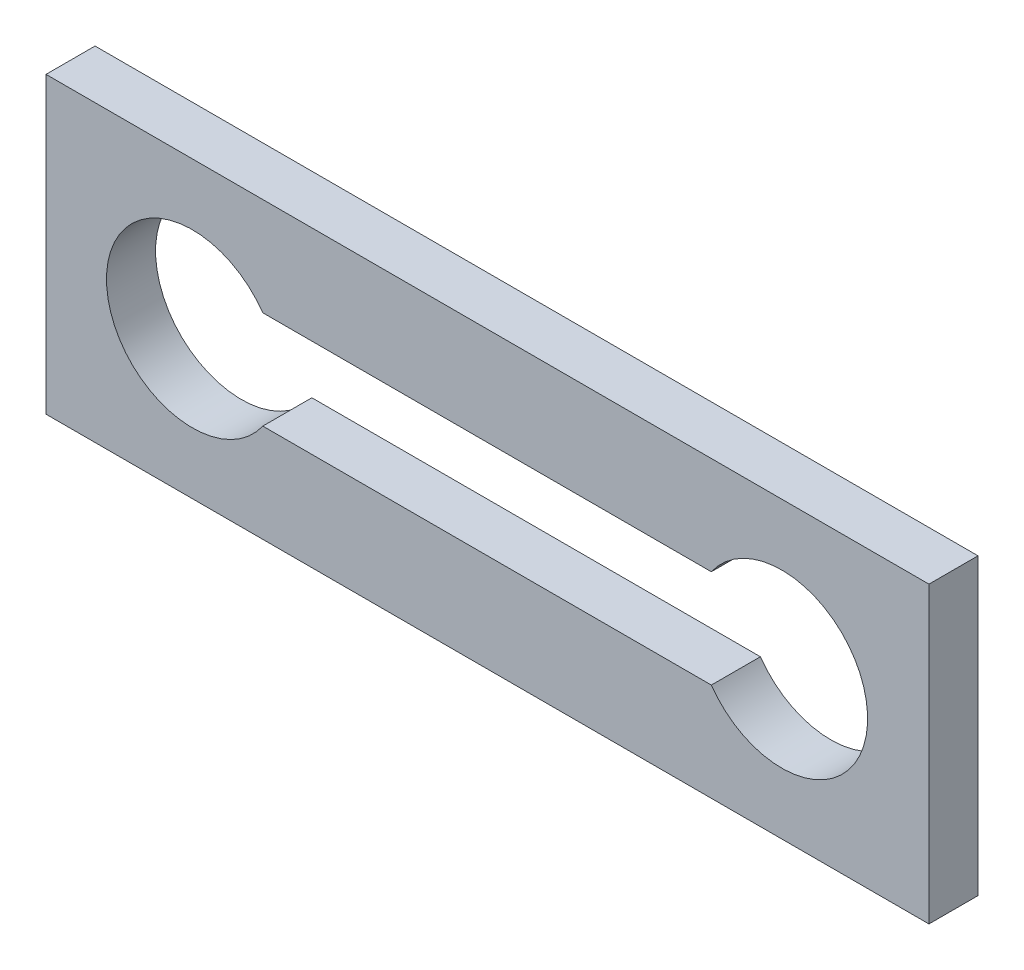
ISO-10303-21;
HEADER;
FILE_DESCRIPTION(('STEP AP214'),'2;1');
FILE_NAME('part.step','',(''),(''),'','','');
FILE_SCHEMA(('AUTOMOTIVE_DESIGN { 1 0 10303 214 1 1 1 1 }'));
ENDSEC;
DATA;
#1=APPLICATION_CONTEXT('core data for automotive mechanical design processes');
#2=APPLICATION_PROTOCOL_DEFINITION('international standard','automotive_design',2000,#1);
#3=PRODUCT_CONTEXT('',#1,'mechanical');
#4=PRODUCT('Part','Part','',(#3));
#5=PRODUCT_RELATED_PRODUCT_CATEGORY('part','',(#4));
#6=PRODUCT_DEFINITION_FORMATION('','',#4);
#7=PRODUCT_DEFINITION_CONTEXT('part definition',#1,'design');
#8=PRODUCT_DEFINITION('design','',#6,#7);
#9=PRODUCT_DEFINITION_SHAPE('','',#8);
#10=(LENGTH_UNIT() NAMED_UNIT(*) SI_UNIT(.MILLI.,.METRE.));
#11=(NAMED_UNIT(*) PLANE_ANGLE_UNIT() SI_UNIT($,.RADIAN.));
#12=(NAMED_UNIT(*) SI_UNIT($,.STERADIAN.) SOLID_ANGLE_UNIT());
#13=UNCERTAINTY_MEASURE_WITH_UNIT(LENGTH_MEASURE(1.E-05),#10,'distance_accuracy_value','');
#14=(GEOMETRIC_REPRESENTATION_CONTEXT(3) GLOBAL_UNCERTAINTY_ASSIGNED_CONTEXT((#13)) GLOBAL_UNIT_ASSIGNED_CONTEXT((#10,
#11,#12)) REPRESENTATION_CONTEXT('',''));
#15=CARTESIAN_POINT('',(0.,0.,0.));
#16=DIRECTION('',(0.,0.,1.));
#17=DIRECTION('',(1.,0.,0.));
#18=AXIS2_PLACEMENT_3D('',#15,#16,#17);
#19=CARTESIAN_POINT('',(57.15,-19.05,6.35));
#20=DIRECTION('',(-1.,0.,0.));
#21=DIRECTION('',(0.,0.,1.));
#22=AXIS2_PLACEMENT_3D('',#19,#20,#21);
#23=PLANE('',#22);
#24=DIRECTION('',(0.,1.,0.));
#25=VECTOR('',#24,1.);
#26=CARTESIAN_POINT('',(57.15,-19.05,0.));
#27=LINE('',#26,#25);
#28=CARTESIAN_POINT('',(57.15,-19.05,0.));
#29=VERTEX_POINT('',#28);
#30=CARTESIAN_POINT('',(57.15,19.05,0.));
#31=VERTEX_POINT('',#30);
#32=EDGE_CURVE('E120',#29,#31,#27,.T.);
#33=ORIENTED_EDGE('',*,*,#32,.T.);
#34=DIRECTION('',(0.,0.,-1.));
#35=VECTOR('',#34,1.);
#36=CARTESIAN_POINT('',(57.15,19.05,6.35));
#37=LINE('',#36,#35);
#38=CARTESIAN_POINT('',(57.15,19.05,6.35));
#39=VERTEX_POINT('',#38);
#40=EDGE_CURVE('E152',#39,#31,#37,.T.);
#41=ORIENTED_EDGE('',*,*,#40,.F.);
#42=DIRECTION('',(0.,1.,0.));
#43=VECTOR('',#42,1.);
#44=CARTESIAN_POINT('',(57.15,-19.05,6.35));
#45=LINE('',#44,#43);
#46=CARTESIAN_POINT('',(57.15,-19.05,6.35));
#47=VERTEX_POINT('',#46);
#48=EDGE_CURVE('E126',#47,#39,#45,.T.);
#49=ORIENTED_EDGE('',*,*,#48,.F.);
#50=DIRECTION('',(0.,0.,-1.));
#51=VECTOR('',#50,1.);
#52=CARTESIAN_POINT('',(57.15,-19.05,6.35));
#53=LINE('',#52,#51);
#54=EDGE_CURVE('E136',#47,#29,#53,.T.);
#55=ORIENTED_EDGE('',*,*,#54,.T.);
#56=EDGE_LOOP('',(#33,#41,#49,#55));
#57=FACE_BOUND('',#56,.T.);
#58=ADVANCED_FACE('F33',(#57),#23,.F.);
#59=CARTESIAN_POINT('',(-57.15,19.05,6.35));
#60=DIRECTION('',(0.,-1.,0.));
#61=DIRECTION('',(0.,0.,-1.));
#62=AXIS2_PLACEMENT_3D('',#59,#60,#61);
#63=PLANE('',#62);
#64=DIRECTION('',(-1.,0.,0.));
#65=VECTOR('',#64,1.);
#66=CARTESIAN_POINT('',(-57.15,19.05,0.));
#67=LINE('',#66,#65);
#68=CARTESIAN_POINT('',(-57.15,19.05,0.));
#69=VERTEX_POINT('',#68);
#70=EDGE_CURVE('E139',#31,#69,#67,.T.);
#71=ORIENTED_EDGE('',*,*,#70,.T.);
#72=DIRECTION('',(0.,0.,-1.));
#73=VECTOR('',#72,1.);
#74=CARTESIAN_POINT('',(-57.15,19.05,6.35));
#75=LINE('',#74,#73);
#76=CARTESIAN_POINT('',(-57.15,19.05,6.35));
#77=VERTEX_POINT('',#76);
#78=EDGE_CURVE('E149',#77,#69,#75,.T.);
#79=ORIENTED_EDGE('',*,*,#78,.F.);
#80=DIRECTION('',(-1.,0.,0.));
#81=VECTOR('',#80,1.);
#82=CARTESIAN_POINT('',(-57.15,19.05,6.35));
#83=LINE('',#82,#81);
#84=EDGE_CURVE('E129',#39,#77,#83,.T.);
#85=ORIENTED_EDGE('',*,*,#84,.F.);
#86=ORIENTED_EDGE('',*,*,#40,.T.);
#87=EDGE_LOOP('',(#71,#79,#85,#86));
#88=FACE_BOUND('',#87,.T.);
#89=ADVANCED_FACE('F172',(#88),#63,.F.);
#90=CARTESIAN_POINT('',(-57.15,-19.05,6.35));
#91=DIRECTION('',(1.,0.,0.));
#92=DIRECTION('',(0.,0.,-1.));
#93=AXIS2_PLACEMENT_3D('',#90,#91,#92);
#94=PLANE('',#93);
#95=DIRECTION('',(0.,-1.,0.));
#96=VECTOR('',#95,1.);
#97=CARTESIAN_POINT('',(-57.15,-19.05,0.));
#98=LINE('',#97,#96);
#99=CARTESIAN_POINT('',(-57.15,-19.05,0.));
#100=VERTEX_POINT('',#99);
#101=EDGE_CURVE('E141',#69,#100,#98,.T.);
#102=ORIENTED_EDGE('',*,*,#101,.T.);
#103=DIRECTION('',(0.,0.,-1.));
#104=VECTOR('',#103,1.);
#105=CARTESIAN_POINT('',(-57.15,-19.05,6.35));
#106=LINE('',#105,#104);
#107=CARTESIAN_POINT('',(-57.15,-19.05,6.35));
#108=VERTEX_POINT('',#107);
#109=EDGE_CURVE('E146',#108,#100,#106,.T.);
#110=ORIENTED_EDGE('',*,*,#109,.F.);
#111=DIRECTION('',(0.,-1.,0.));
#112=VECTOR('',#111,1.);
#113=CARTESIAN_POINT('',(-57.15,-19.05,6.35));
#114=LINE('',#113,#112);
#115=EDGE_CURVE('E132',#77,#108,#114,.T.);
#116=ORIENTED_EDGE('',*,*,#115,.F.);
#117=ORIENTED_EDGE('',*,*,#78,.T.);
#118=EDGE_LOOP('',(#102,#110,#116,#117));
#119=FACE_BOUND('',#118,.T.);
#120=ADVANCED_FACE('F177',(#119),#94,.F.);
#121=CARTESIAN_POINT('',(-57.15,-19.05,6.35));
#122=DIRECTION('',(0.,1.,0.));
#123=DIRECTION('',(0.,0.,1.));
#124=AXIS2_PLACEMENT_3D('',#121,#122,#123);
#125=PLANE('',#124);
#126=DIRECTION('',(1.,0.,0.));
#127=VECTOR('',#126,1.);
#128=CARTESIAN_POINT('',(-57.15,-19.05,0.));
#129=LINE('',#128,#127);
#130=EDGE_CURVE('E130',#100,#29,#129,.T.);
#131=ORIENTED_EDGE('',*,*,#130,.T.);
#132=ORIENTED_EDGE('',*,*,#54,.F.);
#133=DIRECTION('',(1.,0.,0.));
#134=VECTOR('',#133,1.);
#135=CARTESIAN_POINT('',(-57.15,-19.05,6.35));
#136=LINE('',#135,#134);
#137=EDGE_CURVE('E134',#108,#47,#136,.T.);
#138=ORIENTED_EDGE('',*,*,#137,.F.);
#139=ORIENTED_EDGE('',*,*,#109,.T.);
#140=EDGE_LOOP('',(#131,#132,#138,#139));
#141=FACE_BOUND('',#140,.T.);
#142=ADVANCED_FACE('F190',(#141),#125,.F.);
#143=CARTESIAN_POINT('',(0.,0.,6.35));
#144=DIRECTION('',(0.,0.,-1.));
#145=DIRECTION('',(-1.,0.,0.));
#146=AXIS2_PLACEMENT_3D('',#143,#144,#145);
#147=PLANE('',#146);
#148=CARTESIAN_POINT('',(-38.2053218738634,0.,6.35));
#149=DIRECTION('',(0.,0.,1.));
#150=DIRECTION('',(1.,0.,0.));
#151=AXIS2_PLACEMENT_3D('',#148,#149,#150);
#152=CIRCLE('',#151,11.1125);
#153=CARTESIAN_POINT('',(-29.0858286724843,6.35,6.35));
#154=VERTEX_POINT('',#153);
#155=CARTESIAN_POINT('',(-29.0858286724843,-6.35,6.35));
#156=VERTEX_POINT('',#155);
#157=EDGE_CURVE('E110',#154,#156,#152,.T.);
#158=ORIENTED_EDGE('',*,*,#157,.F.);
#159=DIRECTION('',(-1.,0.,0.));
#160=VECTOR('',#159,1.);
#161=CARTESIAN_POINT('',(33.2719988532517,6.35,6.35));
#162=LINE('',#161,#160);
#163=CARTESIAN_POINT('',(28.9805067986209,6.35,6.35));
#164=VERTEX_POINT('',#163);
#165=EDGE_CURVE('E113',#164,#154,#162,.T.);
#166=ORIENTED_EDGE('',*,*,#165,.F.);
#167=CARTESIAN_POINT('',(38.1,0.,6.35));
#168=DIRECTION('',(0.,0.,1.));
#169=DIRECTION('',(1.,0.,0.));
#170=AXIS2_PLACEMENT_3D('',#167,#168,#169);
#171=CIRCLE('',#170,11.1125);
#172=CARTESIAN_POINT('',(28.9805067986209,-6.35,6.35));
#173=VERTEX_POINT('',#172);
#174=EDGE_CURVE('E112',#173,#164,#171,.T.);
#175=ORIENTED_EDGE('',*,*,#174,.F.);
#176=DIRECTION('',(1.,0.,0.));
#177=VECTOR('',#176,1.);
#178=CARTESIAN_POINT('',(33.2719988532517,-6.34999999999999,6.35));
#179=LINE('',#178,#177);
#180=EDGE_CURVE('E47',#156,#173,#179,.T.);
#181=ORIENTED_EDGE('',*,*,#180,.F.);
#182=EDGE_LOOP('',(#158,#166,#175,#181));
#183=FACE_BOUND('',#182,.T.);
#184=ORIENTED_EDGE('',*,*,#48,.T.);
#185=ORIENTED_EDGE('',*,*,#84,.T.);
#186=ORIENTED_EDGE('',*,*,#115,.T.);
#187=ORIENTED_EDGE('',*,*,#137,.T.);
#188=EDGE_LOOP('',(#184,#185,#186,#187));
#189=FACE_BOUND('',#188,.T.);
#190=ADVANCED_FACE('F107',(#183,#189),#147,.F.);
#191=CARTESIAN_POINT('',(0.,0.,0.));
#192=DIRECTION('',(0.,0.,-1.));
#193=DIRECTION('',(-1.,0.,0.));
#194=AXIS2_PLACEMENT_3D('',#191,#192,#193);
#195=PLANE('',#194);
#196=DIRECTION('',(-1.,0.,0.));
#197=VECTOR('',#196,1.);
#198=CARTESIAN_POINT('',(33.2719988532517,6.35,0.));
#199=LINE('',#198,#197);
#200=CARTESIAN_POINT('',(28.9805067986209,6.35000000000001,0.));
#201=VERTEX_POINT('',#200);
#202=CARTESIAN_POINT('',(-29.0858286724843,6.35,0.));
#203=VERTEX_POINT('',#202);
#204=EDGE_CURVE('E55',#201,#203,#199,.T.);
#205=ORIENTED_EDGE('',*,*,#204,.T.);
#206=CARTESIAN_POINT('',(-38.2053218738634,0.,0.));
#207=DIRECTION('',(0.,0.,1.));
#208=DIRECTION('',(1.,0.,0.));
#209=AXIS2_PLACEMENT_3D('',#206,#207,#208);
#210=CIRCLE('',#209,11.1125);
#211=CARTESIAN_POINT('',(-29.0858286724843,-6.35,0.));
#212=VERTEX_POINT('',#211);
#213=EDGE_CURVE('E117',#203,#212,#210,.T.);
#214=ORIENTED_EDGE('',*,*,#213,.T.);
#215=DIRECTION('',(1.,0.,0.));
#216=VECTOR('',#215,1.);
#217=CARTESIAN_POINT('',(33.2719988532517,-6.34999999999999,0.));
#218=LINE('',#217,#216);
#219=CARTESIAN_POINT('',(28.9805067986209,-6.34999999999999,0.));
#220=VERTEX_POINT('',#219);
#221=EDGE_CURVE('E97',#212,#220,#218,.T.);
#222=ORIENTED_EDGE('',*,*,#221,.T.);
#223=CARTESIAN_POINT('',(38.1,0.,0.));
#224=DIRECTION('',(0.,0.,1.));
#225=DIRECTION('',(1.,0.,0.));
#226=AXIS2_PLACEMENT_3D('',#223,#224,#225);
#227=CIRCLE('',#226,11.1125);
#228=EDGE_CURVE('E118',#220,#201,#227,.T.);
#229=ORIENTED_EDGE('',*,*,#228,.T.);
#230=EDGE_LOOP('',(#205,#214,#222,#229));
#231=FACE_BOUND('',#230,.T.);
#232=ORIENTED_EDGE('',*,*,#32,.F.);
#233=ORIENTED_EDGE('',*,*,#130,.F.);
#234=ORIENTED_EDGE('',*,*,#101,.F.);
#235=ORIENTED_EDGE('',*,*,#70,.F.);
#236=EDGE_LOOP('',(#232,#233,#234,#235));
#237=FACE_BOUND('',#236,.T.);
#238=ADVANCED_FACE('F158',(#231,#237),#195,.T.);
#239=CARTESIAN_POINT('',(-38.2053218738634,0.,0.));
#240=DIRECTION('',(0.,0.,1.));
#241=DIRECTION('',(1.,0.,0.));
#242=AXIS2_PLACEMENT_3D('',#239,#240,#241);
#243=CYLINDRICAL_SURFACE('',#242,11.1125);
#244=ORIENTED_EDGE('',*,*,#213,.F.);
#245=DIRECTION('',(0.,0.,1.));
#246=VECTOR('',#245,1.);
#247=CARTESIAN_POINT('',(-29.0858286724843,6.35,0.));
#248=LINE('',#247,#246);
#249=EDGE_CURVE('E102',#203,#154,#248,.T.);
#250=ORIENTED_EDGE('',*,*,#249,.T.);
#251=ORIENTED_EDGE('',*,*,#157,.T.);
#252=DIRECTION('',(0.,0.,1.));
#253=VECTOR('',#252,1.);
#254=CARTESIAN_POINT('',(-29.0858286724843,-6.35,0.));
#255=LINE('',#254,#253);
#256=EDGE_CURVE('E94',#156,#212,#255,.F.);
#257=ORIENTED_EDGE('',*,*,#256,.T.);
#258=EDGE_LOOP('',(#244,#250,#251,#257));
#259=FACE_BOUND('',#258,.T.);
#260=ADVANCED_FACE('F116',(#259),#243,.F.);
#261=CARTESIAN_POINT('',(38.1,0.,0.));
#262=DIRECTION('',(0.,0.,1.));
#263=DIRECTION('',(1.,0.,0.));
#264=AXIS2_PLACEMENT_3D('',#261,#262,#263);
#265=CYLINDRICAL_SURFACE('',#264,11.1125);
#266=ORIENTED_EDGE('',*,*,#174,.T.);
#267=DIRECTION('',(0.,0.,1.));
#268=VECTOR('',#267,1.);
#269=CARTESIAN_POINT('',(28.9805067986209,6.35,0.));
#270=LINE('',#269,#268);
#271=EDGE_CURVE('E11',#164,#201,#270,.F.);
#272=ORIENTED_EDGE('',*,*,#271,.T.);
#273=ORIENTED_EDGE('',*,*,#228,.F.);
#274=DIRECTION('',(0.,0.,1.));
#275=VECTOR('',#274,1.);
#276=CARTESIAN_POINT('',(28.9805067986209,-6.34999999999999,0.));
#277=LINE('',#276,#275);
#278=EDGE_CURVE('E40',#220,#173,#277,.T.);
#279=ORIENTED_EDGE('',*,*,#278,.T.);
#280=EDGE_LOOP('',(#266,#272,#273,#279));
#281=FACE_BOUND('',#280,.T.);
#282=ADVANCED_FACE('F156',(#281),#265,.F.);
#283=CARTESIAN_POINT('',(33.2719988532517,-6.34999999999999,0.));
#284=DIRECTION('',(0.,-1.,0.));
#285=DIRECTION('',(1.,0.,0.));
#286=AXIS2_PLACEMENT_3D('',#283,#284,#285);
#287=PLANE('',#286);
#288=ORIENTED_EDGE('',*,*,#180,.T.);
#289=ORIENTED_EDGE('',*,*,#278,.F.);
#290=ORIENTED_EDGE('',*,*,#221,.F.);
#291=ORIENTED_EDGE('',*,*,#256,.F.);
#292=EDGE_LOOP('',(#288,#289,#290,#291));
#293=FACE_BOUND('',#292,.T.);
#294=ADVANCED_FACE('F95',(#293),#287,.F.);
#295=CARTESIAN_POINT('',(33.2719988532517,6.35,0.));
#296=DIRECTION('',(0.,1.,0.));
#297=DIRECTION('',(-1.,0.,0.));
#298=AXIS2_PLACEMENT_3D('',#295,#296,#297);
#299=PLANE('',#298);
#300=ORIENTED_EDGE('',*,*,#204,.F.);
#301=ORIENTED_EDGE('',*,*,#271,.F.);
#302=ORIENTED_EDGE('',*,*,#165,.T.);
#303=ORIENTED_EDGE('',*,*,#249,.F.);
#304=EDGE_LOOP('',(#300,#301,#302,#303));
#305=FACE_BOUND('',#304,.T.);
#306=ADVANCED_FACE('F164',(#305),#299,.F.);
#307=CLOSED_SHELL('',(#58,#89,#120,#142,#190,#238,#260,#282,#294,#306));
#308=MANIFOLD_SOLID_BREP('B2',#307);
#309=ADVANCED_BREP_SHAPE_REPRESENTATION('',(#18,#308),#14);
#310=SHAPE_DEFINITION_REPRESENTATION(#9,#309);
ENDSEC;
END-ISO-10303-21;
